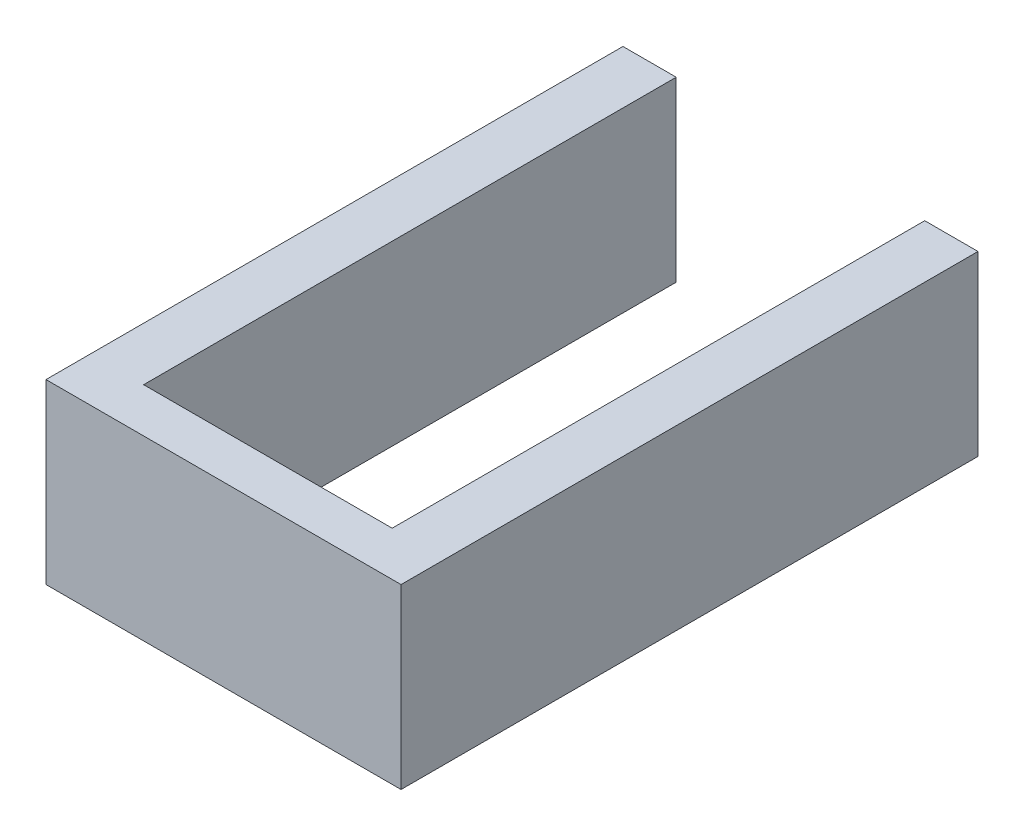
ISO-10303-21;
HEADER;
FILE_DESCRIPTION(('STEP AP214'),'2;1');
FILE_NAME('part.step','',(''),(''),'','','');
FILE_SCHEMA(('AUTOMOTIVE_DESIGN { 1 0 10303 214 1 1 1 1 }'));
ENDSEC;
DATA;
#1=APPLICATION_CONTEXT('core data for automotive mechanical design processes');
#2=APPLICATION_PROTOCOL_DEFINITION('international standard','automotive_design',2000,#1);
#3=PRODUCT_CONTEXT('',#1,'mechanical');
#4=PRODUCT('Part','Part','',(#3));
#5=PRODUCT_RELATED_PRODUCT_CATEGORY('part','',(#4));
#6=PRODUCT_DEFINITION_FORMATION('','',#4);
#7=PRODUCT_DEFINITION_CONTEXT('part definition',#1,'design');
#8=PRODUCT_DEFINITION('design','',#6,#7);
#9=PRODUCT_DEFINITION_SHAPE('','',#8);
#10=(LENGTH_UNIT() NAMED_UNIT(*) SI_UNIT(.MILLI.,.METRE.));
#11=(NAMED_UNIT(*) PLANE_ANGLE_UNIT() SI_UNIT($,.RADIAN.));
#12=(NAMED_UNIT(*) SI_UNIT($,.STERADIAN.) SOLID_ANGLE_UNIT());
#13=UNCERTAINTY_MEASURE_WITH_UNIT(LENGTH_MEASURE(1.E-05),#10,'distance_accuracy_value','');
#14=(GEOMETRIC_REPRESENTATION_CONTEXT(3) GLOBAL_UNCERTAINTY_ASSIGNED_CONTEXT((#13)) GLOBAL_UNIT_ASSIGNED_CONTEXT((#10,
#11,#12)) REPRESENTATION_CONTEXT('',''));
#15=CARTESIAN_POINT('',(0.,0.,0.));
#16=DIRECTION('',(0.,0.,1.));
#17=DIRECTION('',(1.,0.,0.));
#18=AXIS2_PLACEMENT_3D('',#15,#16,#17);
#19=CARTESIAN_POINT('',(0.,0.,0.));
#20=DIRECTION('',(0.,0.,1.));
#21=DIRECTION('',(1.,0.,0.));
#22=AXIS2_PLACEMENT_3D('',#19,#20,#21);
#23=PLANE('',#22);
#24=DIRECTION('',(0.,-1.,0.));
#25=VECTOR('',#24,1.);
#26=CARTESIAN_POINT('',(-12.9583333333333,10.6770833333333,0.));
#27=LINE('',#26,#25);
#28=CARTESIAN_POINT('',(-12.9583333333333,10.6770833333333,0.));
#29=VERTEX_POINT('',#28);
#30=CARTESIAN_POINT('',(-12.9583333333333,-9.32291666666667,0.));
#31=VERTEX_POINT('',#30);
#32=EDGE_CURVE('E122',#29,#31,#27,.T.);
#33=ORIENTED_EDGE('',*,*,#32,.F.);
#34=DIRECTION('',(-1.,0.,0.));
#35=VECTOR('',#34,1.);
#36=CARTESIAN_POINT('',(-18.9583333333333,10.6770833333333,0.));
#37=LINE('',#36,#35);
#38=CARTESIAN_POINT('',(15.0416666666667,10.6770833333333,0.));
#39=VERTEX_POINT('',#38);
#40=EDGE_CURVE('E152',#39,#29,#37,.T.);
#41=ORIENTED_EDGE('',*,*,#40,.F.);
#42=DIRECTION('',(0.,1.,0.));
#43=VECTOR('',#42,1.);
#44=CARTESIAN_POINT('',(15.0416666666667,10.6770833333333,0.));
#45=LINE('',#44,#43);
#46=CARTESIAN_POINT('',(15.0416666666667,-9.32291666666667,0.));
#47=VERTEX_POINT('',#46);
#48=EDGE_CURVE('E131',#47,#39,#45,.T.);
#49=ORIENTED_EDGE('',*,*,#48,.F.);
#50=DIRECTION('',(1.,0.,0.));
#51=VECTOR('',#50,1.);
#52=CARTESIAN_POINT('',(-18.9583333333333,-9.32291666666667,0.));
#53=LINE('',#52,#51);
#54=EDGE_CURVE('E48',#31,#47,#53,.T.);
#55=ORIENTED_EDGE('',*,*,#54,.F.);
#56=EDGE_LOOP('',(#33,#41,#49,#55));
#57=FACE_BOUND('',#56,.T.);
#58=ADVANCED_FACE('F33',(#57),#23,.F.);
#59=CARTESIAN_POINT('',(-18.9583333333333,10.6770833333333,5.));
#60=DIRECTION('',(1.,0.,0.));
#61=DIRECTION('',(0.,0.,-1.));
#62=AXIS2_PLACEMENT_3D('',#59,#60,#61);
#63=PLANE('',#62);
#64=DIRECTION('',(0.,0.,-1.));
#65=VECTOR('',#64,1.);
#66=CARTESIAN_POINT('',(-18.9583333333333,10.6770833333333,5.));
#67=LINE('',#66,#65);
#68=CARTESIAN_POINT('',(-18.9583333333333,10.6770833333333,5.));
#69=VERTEX_POINT('',#68);
#70=CARTESIAN_POINT('',(-18.9583333333333,10.6770833333333,-60.));
#71=VERTEX_POINT('',#70);
#72=EDGE_CURVE('E100',#69,#71,#67,.T.);
#73=ORIENTED_EDGE('',*,*,#72,.T.);
#74=DIRECTION('',(0.,1.,0.));
#75=VECTOR('',#74,1.);
#76=CARTESIAN_POINT('',(-18.9583333333333,10.6770833333333,-60.));
#77=LINE('',#76,#75);
#78=CARTESIAN_POINT('',(-18.9583333333333,-9.32291666666667,-60.));
#79=VERTEX_POINT('',#78);
#80=EDGE_CURVE('E104',#79,#71,#77,.T.);
#81=ORIENTED_EDGE('',*,*,#80,.F.);
#82=DIRECTION('',(0.,0.,-1.));
#83=VECTOR('',#82,1.);
#84=CARTESIAN_POINT('',(-18.9583333333333,-9.32291666666667,5.));
#85=LINE('',#84,#83);
#86=CARTESIAN_POINT('',(-18.9583333333333,-9.32291666666667,5.));
#87=VERTEX_POINT('',#86);
#88=EDGE_CURVE('E11',#87,#79,#85,.T.);
#89=ORIENTED_EDGE('',*,*,#88,.F.);
#90=DIRECTION('',(0.,-1.,0.));
#91=VECTOR('',#90,1.);
#92=CARTESIAN_POINT('',(-18.9583333333333,10.6770833333333,5.));
#93=LINE('',#92,#91);
#94=EDGE_CURVE('E105',#69,#87,#93,.T.);
#95=ORIENTED_EDGE('',*,*,#94,.F.);
#96=EDGE_LOOP('',(#73,#81,#89,#95));
#97=FACE_BOUND('',#96,.T.);
#98=ADVANCED_FACE('F35',(#97),#63,.F.);
#99=CARTESIAN_POINT('',(-18.9583333333333,-9.32291666666667,5.));
#100=DIRECTION('',(0.,1.,0.));
#101=DIRECTION('',(0.,0.,1.));
#102=AXIS2_PLACEMENT_3D('',#99,#100,#101);
#103=PLANE('',#102);
#104=ORIENTED_EDGE('',*,*,#88,.T.);
#105=DIRECTION('',(-1.,0.,0.));
#106=VECTOR('',#105,1.);
#107=CARTESIAN_POINT('',(-18.9583333333333,-9.32291666666667,-60.));
#108=LINE('',#107,#106);
#109=CARTESIAN_POINT('',(-12.9583333333333,-9.32291666666667,-60.));
#110=VERTEX_POINT('',#109);
#111=EDGE_CURVE('E121',#110,#79,#108,.T.);
#112=ORIENTED_EDGE('',*,*,#111,.F.);
#113=DIRECTION('',(0.,0.,1.));
#114=VECTOR('',#113,1.);
#115=CARTESIAN_POINT('',(-12.9583333333333,-9.32291666666667,-60.));
#116=LINE('',#115,#114);
#117=EDGE_CURVE('E127',#110,#31,#116,.T.);
#118=ORIENTED_EDGE('',*,*,#117,.T.);
#119=ORIENTED_EDGE('',*,*,#54,.T.);
#120=DIRECTION('',(0.,0.,1.));
#121=VECTOR('',#120,1.);
#122=CARTESIAN_POINT('',(15.0416666666667,-9.32291666666667,-60.));
#123=LINE('',#122,#121);
#124=CARTESIAN_POINT('',(15.0416666666667,-9.32291666666667,-60.));
#125=VERTEX_POINT('',#124);
#126=EDGE_CURVE('E147',#125,#47,#123,.T.);
#127=ORIENTED_EDGE('',*,*,#126,.F.);
#128=DIRECTION('',(-1.,0.,0.));
#129=VECTOR('',#128,1.);
#130=CARTESIAN_POINT('',(21.0416666666667,-9.32291666666667,-60.));
#131=LINE('',#130,#129);
#132=CARTESIAN_POINT('',(21.0416666666667,-9.32291666666667,-60.));
#133=VERTEX_POINT('',#132);
#134=EDGE_CURVE('E135',#133,#125,#131,.T.);
#135=ORIENTED_EDGE('',*,*,#134,.F.);
#136=DIRECTION('',(0.,0.,-1.));
#137=VECTOR('',#136,1.);
#138=CARTESIAN_POINT('',(21.0416666666667,-9.32291666666667,5.));
#139=LINE('',#138,#137);
#140=CARTESIAN_POINT('',(21.0416666666667,-9.32291666666667,5.));
#141=VERTEX_POINT('',#140);
#142=EDGE_CURVE('E41',#141,#133,#139,.T.);
#143=ORIENTED_EDGE('',*,*,#142,.F.);
#144=DIRECTION('',(1.,0.,0.));
#145=VECTOR('',#144,1.);
#146=CARTESIAN_POINT('',(-18.9583333333333,-9.32291666666667,5.));
#147=LINE('',#146,#145);
#148=EDGE_CURVE('E151',#87,#141,#147,.T.);
#149=ORIENTED_EDGE('',*,*,#148,.F.);
#150=EDGE_LOOP('',(#104,#112,#118,#119,#127,#135,#143,#149));
#151=FACE_BOUND('',#150,.T.);
#152=ADVANCED_FACE('F166',(#151),#103,.F.);
#153=CARTESIAN_POINT('',(21.0416666666667,10.6770833333333,5.));
#154=DIRECTION('',(-1.,0.,0.));
#155=DIRECTION('',(0.,-1.,0.));
#156=AXIS2_PLACEMENT_3D('',#153,#154,#155);
#157=PLANE('',#156);
#158=ORIENTED_EDGE('',*,*,#142,.T.);
#159=DIRECTION('',(0.,-1.,0.));
#160=VECTOR('',#159,1.);
#161=CARTESIAN_POINT('',(21.0416666666667,10.6770833333333,-60.));
#162=LINE('',#161,#160);
#163=CARTESIAN_POINT('',(21.0416666666667,10.6770833333333,-60.));
#164=VERTEX_POINT('',#163);
#165=EDGE_CURVE('E132',#164,#133,#162,.T.);
#166=ORIENTED_EDGE('',*,*,#165,.F.);
#167=DIRECTION('',(0.,0.,-1.));
#168=VECTOR('',#167,1.);
#169=CARTESIAN_POINT('',(21.0416666666667,10.6770833333333,5.));
#170=LINE('',#169,#168);
#171=CARTESIAN_POINT('',(21.0416666666667,10.6770833333333,5.));
#172=VERTEX_POINT('',#171);
#173=EDGE_CURVE('E107',#172,#164,#170,.T.);
#174=ORIENTED_EDGE('',*,*,#173,.F.);
#175=DIRECTION('',(0.,1.,0.));
#176=VECTOR('',#175,1.);
#177=CARTESIAN_POINT('',(21.0416666666667,10.6770833333333,5.));
#178=LINE('',#177,#176);
#179=EDGE_CURVE('E154',#141,#172,#178,.T.);
#180=ORIENTED_EDGE('',*,*,#179,.F.);
#181=EDGE_LOOP('',(#158,#166,#174,#180));
#182=FACE_BOUND('',#181,.T.);
#183=ADVANCED_FACE('F164',(#182),#157,.F.);
#184=CARTESIAN_POINT('',(-18.9583333333333,10.6770833333333,5.));
#185=DIRECTION('',(0.,-1.,0.));
#186=DIRECTION('',(0.,0.,-1.));
#187=AXIS2_PLACEMENT_3D('',#184,#185,#186);
#188=PLANE('',#187);
#189=ORIENTED_EDGE('',*,*,#173,.T.);
#190=DIRECTION('',(1.,0.,0.));
#191=VECTOR('',#190,1.);
#192=CARTESIAN_POINT('',(21.0416666666667,10.6770833333333,-60.));
#193=LINE('',#192,#191);
#194=CARTESIAN_POINT('',(15.0416666666667,10.6770833333333,-60.));
#195=VERTEX_POINT('',#194);
#196=EDGE_CURVE('E139',#195,#164,#193,.T.);
#197=ORIENTED_EDGE('',*,*,#196,.F.);
#198=DIRECTION('',(0.,0.,1.));
#199=VECTOR('',#198,1.);
#200=CARTESIAN_POINT('',(15.0416666666667,10.6770833333333,-60.));
#201=LINE('',#200,#199);
#202=EDGE_CURVE('E142',#195,#39,#201,.T.);
#203=ORIENTED_EDGE('',*,*,#202,.T.);
#204=ORIENTED_EDGE('',*,*,#40,.T.);
#205=DIRECTION('',(0.,0.,1.));
#206=VECTOR('',#205,1.);
#207=CARTESIAN_POINT('',(-12.9583333333333,10.6770833333333,-60.));
#208=LINE('',#207,#206);
#209=CARTESIAN_POINT('',(-12.9583333333333,10.6770833333333,-60.));
#210=VERTEX_POINT('',#209);
#211=EDGE_CURVE('E113',#210,#29,#208,.T.);
#212=ORIENTED_EDGE('',*,*,#211,.F.);
#213=DIRECTION('',(1.,0.,0.));
#214=VECTOR('',#213,1.);
#215=CARTESIAN_POINT('',(-18.9583333333333,10.6770833333333,-60.));
#216=LINE('',#215,#214);
#217=EDGE_CURVE('E110',#71,#210,#216,.T.);
#218=ORIENTED_EDGE('',*,*,#217,.F.);
#219=ORIENTED_EDGE('',*,*,#72,.F.);
#220=DIRECTION('',(-1.,0.,0.));
#221=VECTOR('',#220,1.);
#222=CARTESIAN_POINT('',(-18.9583333333333,10.6770833333333,5.));
#223=LINE('',#222,#221);
#224=EDGE_CURVE('E56',#172,#69,#223,.T.);
#225=ORIENTED_EDGE('',*,*,#224,.F.);
#226=EDGE_LOOP('',(#189,#197,#203,#204,#212,#218,#219,#225));
#227=FACE_BOUND('',#226,.T.);
#228=ADVANCED_FACE('F111',(#227),#188,.F.);
#229=CARTESIAN_POINT('',(0.,0.,5.));
#230=DIRECTION('',(0.,0.,1.));
#231=DIRECTION('',(1.,0.,0.));
#232=AXIS2_PLACEMENT_3D('',#229,#230,#231);
#233=PLANE('',#232);
#234=ORIENTED_EDGE('',*,*,#94,.T.);
#235=ORIENTED_EDGE('',*,*,#148,.T.);
#236=ORIENTED_EDGE('',*,*,#179,.T.);
#237=ORIENTED_EDGE('',*,*,#224,.T.);
#238=EDGE_LOOP('',(#234,#235,#236,#237));
#239=FACE_BOUND('',#238,.T.);
#240=ADVANCED_FACE('F179',(#239),#233,.T.);
#241=CARTESIAN_POINT('',(15.0416666666667,10.6770833333333,-60.));
#242=DIRECTION('',(1.,0.,0.));
#243=DIRECTION('',(0.,1.,0.));
#244=AXIS2_PLACEMENT_3D('',#241,#242,#243);
#245=PLANE('',#244);
#246=ORIENTED_EDGE('',*,*,#48,.T.);
#247=ORIENTED_EDGE('',*,*,#202,.F.);
#248=DIRECTION('',(0.,1.,0.));
#249=VECTOR('',#248,1.);
#250=CARTESIAN_POINT('',(15.0416666666667,10.6770833333333,-60.));
#251=LINE('',#250,#249);
#252=EDGE_CURVE('E137',#125,#195,#251,.T.);
#253=ORIENTED_EDGE('',*,*,#252,.F.);
#254=ORIENTED_EDGE('',*,*,#126,.T.);
#255=EDGE_LOOP('',(#246,#247,#253,#254));
#256=FACE_BOUND('',#255,.T.);
#257=ADVANCED_FACE('F173',(#256),#245,.F.);
#258=CARTESIAN_POINT('',(0.,0.,-60.));
#259=DIRECTION('',(0.,0.,-1.));
#260=DIRECTION('',(-1.,0.,0.));
#261=AXIS2_PLACEMENT_3D('',#258,#259,#260);
#262=PLANE('',#261);
#263=ORIENTED_EDGE('',*,*,#165,.T.);
#264=ORIENTED_EDGE('',*,*,#134,.T.);
#265=ORIENTED_EDGE('',*,*,#252,.T.);
#266=ORIENTED_EDGE('',*,*,#196,.T.);
#267=EDGE_LOOP('',(#263,#264,#265,#266));
#268=FACE_BOUND('',#267,.T.);
#269=ADVANCED_FACE('F169',(#268),#262,.T.);
#270=CARTESIAN_POINT('',(-12.9583333333333,10.6770833333333,-60.));
#271=DIRECTION('',(-1.,0.,0.));
#272=DIRECTION('',(0.,-1.,0.));
#273=AXIS2_PLACEMENT_3D('',#270,#271,#272);
#274=PLANE('',#273);
#275=ORIENTED_EDGE('',*,*,#32,.T.);
#276=ORIENTED_EDGE('',*,*,#117,.F.);
#277=DIRECTION('',(0.,-1.,0.));
#278=VECTOR('',#277,1.);
#279=CARTESIAN_POINT('',(-12.9583333333333,10.6770833333333,-60.));
#280=LINE('',#279,#278);
#281=EDGE_CURVE('E116',#210,#110,#280,.T.);
#282=ORIENTED_EDGE('',*,*,#281,.F.);
#283=ORIENTED_EDGE('',*,*,#211,.T.);
#284=EDGE_LOOP('',(#275,#276,#282,#283));
#285=FACE_BOUND('',#284,.T.);
#286=ADVANCED_FACE('F178',(#285),#274,.F.);
#287=CARTESIAN_POINT('',(0.,0.,-60.));
#288=DIRECTION('',(0.,0.,1.));
#289=DIRECTION('',(1.,0.,0.));
#290=AXIS2_PLACEMENT_3D('',#287,#288,#289);
#291=PLANE('',#290);
#292=ORIENTED_EDGE('',*,*,#80,.T.);
#293=ORIENTED_EDGE('',*,*,#217,.T.);
#294=ORIENTED_EDGE('',*,*,#281,.T.);
#295=ORIENTED_EDGE('',*,*,#111,.T.);
#296=EDGE_LOOP('',(#292,#293,#294,#295));
#297=FACE_BOUND('',#296,.T.);
#298=ADVANCED_FACE('F119',(#297),#291,.F.);
#299=CLOSED_SHELL('',(#58,#98,#152,#183,#228,#240,#257,#269,#286,#298));
#300=MANIFOLD_SOLID_BREP('B2',#299);
#301=ADVANCED_BREP_SHAPE_REPRESENTATION('',(#18,#300),#14);
#302=SHAPE_DEFINITION_REPRESENTATION(#9,#301);
ENDSEC;
END-ISO-10303-21;
